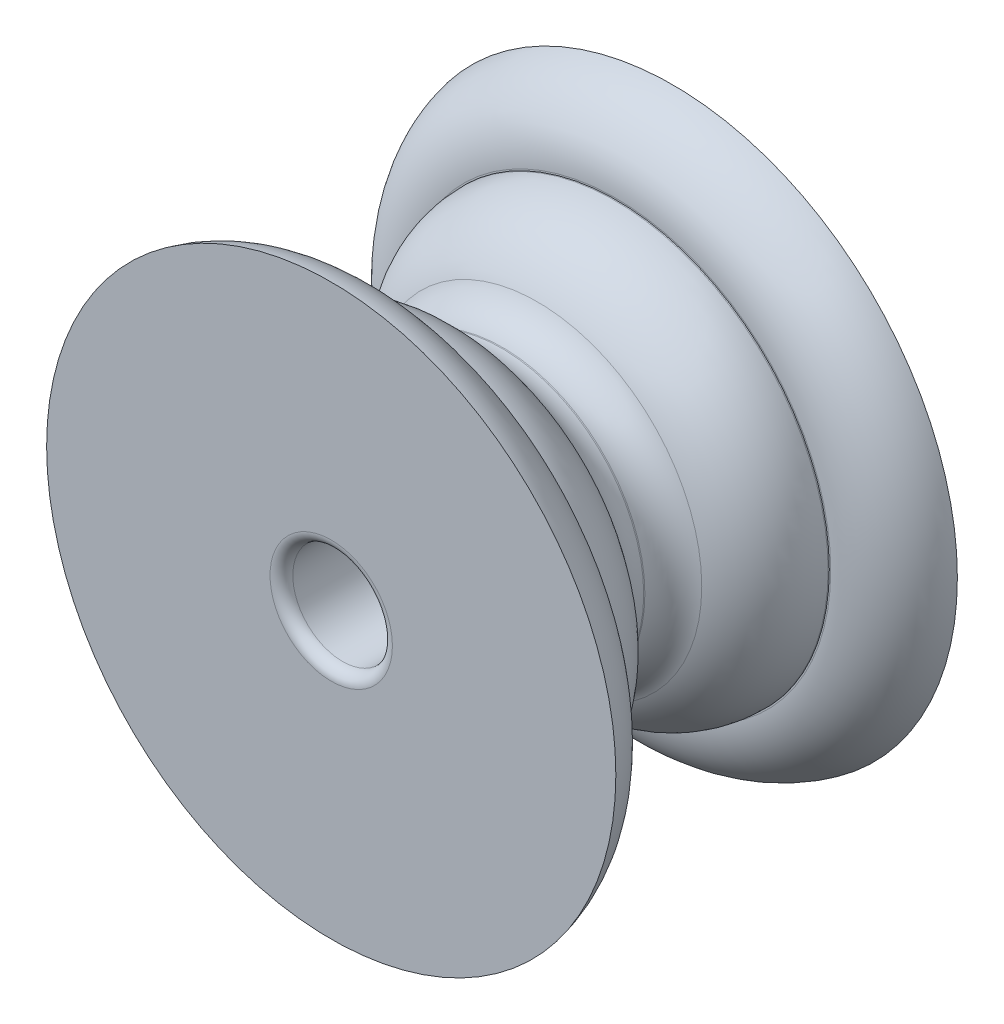
ISO-10303-21;
HEADER;
FILE_DESCRIPTION(('STEP AP214'),'2;1');
FILE_NAME('part.step','',(''),(''),'','','');
FILE_SCHEMA(('AUTOMOTIVE_DESIGN { 1 0 10303 214 1 1 1 1 }'));
ENDSEC;
DATA;
#1=APPLICATION_CONTEXT('core data for automotive mechanical design processes');
#2=APPLICATION_PROTOCOL_DEFINITION('international standard','automotive_design',2000,#1);
#3=PRODUCT_CONTEXT('',#1,'mechanical');
#4=PRODUCT('Part','Part','',(#3));
#5=PRODUCT_RELATED_PRODUCT_CATEGORY('part','',(#4));
#6=PRODUCT_DEFINITION_FORMATION('','',#4);
#7=PRODUCT_DEFINITION_CONTEXT('part definition',#1,'design');
#8=PRODUCT_DEFINITION('design','',#6,#7);
#9=PRODUCT_DEFINITION_SHAPE('','',#8);
#10=(LENGTH_UNIT() NAMED_UNIT(*) SI_UNIT(.MILLI.,.METRE.));
#11=(NAMED_UNIT(*) PLANE_ANGLE_UNIT() SI_UNIT($,.RADIAN.));
#12=(NAMED_UNIT(*) SI_UNIT($,.STERADIAN.) SOLID_ANGLE_UNIT());
#13=UNCERTAINTY_MEASURE_WITH_UNIT(LENGTH_MEASURE(1.E-05),#10,'distance_accuracy_value','');
#14=(GEOMETRIC_REPRESENTATION_CONTEXT(3) GLOBAL_UNCERTAINTY_ASSIGNED_CONTEXT((#13)) GLOBAL_UNIT_ASSIGNED_CONTEXT((#10,
#11,#12)) REPRESENTATION_CONTEXT('',''));
#15=CARTESIAN_POINT('',(0.,0.,0.));
#16=DIRECTION('',(0.,0.,1.));
#17=DIRECTION('',(1.,0.,0.));
#18=AXIS2_PLACEMENT_3D('',#15,#16,#17);
#19=CARTESIAN_POINT('',(0.,0.,2.));
#20=DIRECTION('',(0.,0.,1.));
#21=DIRECTION('',(1.,0.,0.));
#22=AXIS2_PLACEMENT_3D('',#19,#20,#21);
#23=PLANE('',#22);
#24=CARTESIAN_POINT('',(0.,0.,2.));
#25=DIRECTION('',(0.,0.,1.));
#26=DIRECTION('',(1.,0.,0.));
#27=AXIS2_PLACEMENT_3D('',#24,#25,#26);
#28=CIRCLE('',#27,7.55051025721682);
#29=CARTESIAN_POINT('',(7.55051025721682,0.,2.));
#30=VERTEX_POINT('',#29);
#31=EDGE_CURVE('E40',#30,#30,#28,.T.);
#32=ORIENTED_EDGE('',*,*,#31,.T.);
#33=EDGE_LOOP('',(#32));
#34=FACE_BOUND('',#33,.T.);
#35=CARTESIAN_POINT('',(0.,0.,2.));
#36=DIRECTION('',(0.,0.,1.));
#37=DIRECTION('',(1.,0.,0.));
#38=AXIS2_PLACEMENT_3D('',#35,#36,#37);
#39=CIRCLE('',#38,7.5);
#40=CARTESIAN_POINT('',(7.5,0.,2.));
#41=VERTEX_POINT('',#40);
#42=EDGE_CURVE('E77',#41,#41,#39,.T.);
#43=ORIENTED_EDGE('',*,*,#42,.F.);
#44=EDGE_LOOP('',(#43));
#45=FACE_BOUND('',#44,.T.);
#46=ADVANCED_FACE('F33',(#34,#45),#23,.T.);
#47=CARTESIAN_POINT('',(0.,0.,0.));
#48=DIRECTION('',(0.,0.,1.));
#49=DIRECTION('',(1.,0.,0.));
#50=AXIS2_PLACEMENT_3D('',#47,#48,#49);
#51=PLANE('',#50);
#52=CARTESIAN_POINT('',(0.,0.,0.));
#53=DIRECTION('',(0.,0.,1.));
#54=DIRECTION('',(1.,0.,0.));
#55=AXIS2_PLACEMENT_3D('',#52,#53,#54);
#56=CIRCLE('',#55,2.15);
#57=CARTESIAN_POINT('',(2.15,0.,0.));
#58=VERTEX_POINT('',#57);
#59=EDGE_CURVE('E44',#58,#58,#56,.T.);
#60=ORIENTED_EDGE('',*,*,#59,.T.);
#61=EDGE_LOOP('',(#60));
#62=FACE_BOUND('',#61,.T.);
#63=CARTESIAN_POINT('',(0.,0.,0.));
#64=DIRECTION('',(0.,0.,1.));
#65=DIRECTION('',(1.,0.,0.));
#66=AXIS2_PLACEMENT_3D('',#63,#64,#65);
#67=CIRCLE('',#66,10.);
#68=CARTESIAN_POINT('',(10.,0.,0.));
#69=VERTEX_POINT('',#68);
#70=EDGE_CURVE('E78',#69,#69,#67,.T.);
#71=ORIENTED_EDGE('',*,*,#70,.F.);
#72=EDGE_LOOP('',(#71));
#73=FACE_BOUND('',#72,.T.);
#74=ADVANCED_FACE('F101',(#62,#73),#51,.F.);
#75=CARTESIAN_POINT('',(0.,0.,5.));
#76=DIRECTION('',(0.,0.,-1.));
#77=DIRECTION('',(-1.,0.,0.));
#78=AXIS2_PLACEMENT_3D('',#75,#76,#77);
#79=CYLINDRICAL_SURFACE('',#78,7.5);
#80=CARTESIAN_POINT('',(0.,0.,2.04196010845019));
#81=DIRECTION('',(0.,0.,1.));
#82=DIRECTION('',(1.,0.,0.));
#83=AXIS2_PLACEMENT_3D('',#80,#81,#82);
#84=CIRCLE('',#83,7.5);
#85=CARTESIAN_POINT('',(7.5,0.,2.04196010845019));
#86=VERTEX_POINT('',#85);
#87=EDGE_CURVE('E74',#86,#86,#84,.F.);
#88=ORIENTED_EDGE('',*,*,#87,.T.);
#89=EDGE_LOOP('',(#88));
#90=FACE_BOUND('',#89,.T.);
#91=ORIENTED_EDGE('',*,*,#42,.T.);
#92=EDGE_LOOP('',(#91));
#93=FACE_BOUND('',#92,.T.);
#94=ADVANCED_FACE('F108',(#90,#93),#79,.T.);
#95=CARTESIAN_POINT('',(0.,0.,7.));
#96=DIRECTION('',(0.,0.,-1.));
#97=DIRECTION('',(-1.,0.,0.));
#98=AXIS2_PLACEMENT_3D('',#95,#96,#97);
#99=CYLINDRICAL_SURFACE('',#98,5.);
#100=CARTESIAN_POINT('',(0.,0.,5.9789640454561));
#101=DIRECTION('',(0.,0.,1.));
#102=DIRECTION('',(1.,0.,0.));
#103=AXIS2_PLACEMENT_3D('',#100,#101,#102);
#104=CIRCLE('',#103,5.);
#105=CARTESIAN_POINT('',(5.,0.,5.9789640454561));
#106=VERTEX_POINT('',#105);
#107=EDGE_CURVE('E65',#106,#106,#104,.T.);
#108=ORIENTED_EDGE('',*,*,#107,.T.);
#109=EDGE_LOOP('',(#108));
#110=FACE_BOUND('',#109,.T.);
#111=CARTESIAN_POINT('',(0.,0.,6.0210359545439));
#112=DIRECTION('',(0.,0.,1.));
#113=DIRECTION('',(1.,0.,0.));
#114=AXIS2_PLACEMENT_3D('',#111,#112,#113);
#115=CIRCLE('',#114,5.);
#116=CARTESIAN_POINT('',(5.,0.,6.0210359545439));
#117=VERTEX_POINT('',#116);
#118=EDGE_CURVE('E68',#117,#117,#115,.F.);
#119=ORIENTED_EDGE('',*,*,#118,.T.);
#120=EDGE_LOOP('',(#119));
#121=FACE_BOUND('',#120,.T.);
#122=ADVANCED_FACE('F157',(#110,#121),#99,.T.);
#123=CARTESIAN_POINT('',(0.,0.,10.));
#124=DIRECTION('',(0.,0.,-1.));
#125=DIRECTION('',(-1.,0.,0.));
#126=AXIS2_PLACEMENT_3D('',#123,#124,#125);
#127=CYLINDRICAL_SURFACE('',#126,7.5);
#128=CARTESIAN_POINT('',(0.,0.,9.95803989154981));
#129=DIRECTION('',(0.,0.,-1.));
#130=DIRECTION('',(-1.,0.,0.));
#131=AXIS2_PLACEMENT_3D('',#128,#129,#130);
#132=CIRCLE('',#131,7.5);
#133=CARTESIAN_POINT('',(-7.5,0.,9.95803989154981));
#134=VERTEX_POINT('',#133);
#135=EDGE_CURVE('E71',#134,#134,#132,.F.);
#136=ORIENTED_EDGE('',*,*,#135,.T.);
#137=EDGE_LOOP('',(#136));
#138=FACE_BOUND('',#137,.T.);
#139=CARTESIAN_POINT('',(0.,0.,10.));
#140=DIRECTION('',(0.,0.,1.));
#141=DIRECTION('',(1.,0.,0.));
#142=AXIS2_PLACEMENT_3D('',#139,#140,#141);
#143=CIRCLE('',#142,7.5);
#144=CARTESIAN_POINT('',(7.5,0.,10.));
#145=VERTEX_POINT('',#144);
#146=EDGE_CURVE('E81',#145,#145,#143,.T.);
#147=ORIENTED_EDGE('',*,*,#146,.F.);
#148=EDGE_LOOP('',(#147));
#149=FACE_BOUND('',#148,.T.);
#150=ADVANCED_FACE('F153',(#138,#149),#127,.T.);
#151=CARTESIAN_POINT('',(0.,0.,12.));
#152=DIRECTION('',(0.,0.,1.));
#153=DIRECTION('',(1.,0.,0.));
#154=AXIS2_PLACEMENT_3D('',#151,#152,#153);
#155=PLANE('',#154);
#156=CARTESIAN_POINT('',(0.,0.,12.));
#157=DIRECTION('',(0.,0.,1.));
#158=DIRECTION('',(1.,0.,0.));
#159=AXIS2_PLACEMENT_3D('',#156,#157,#158);
#160=CIRCLE('',#159,2.15);
#161=CARTESIAN_POINT('',(2.15,0.,12.));
#162=VERTEX_POINT('',#161);
#163=EDGE_CURVE('E48',#162,#162,#160,.F.);
#164=ORIENTED_EDGE('',*,*,#163,.T.);
#165=EDGE_LOOP('',(#164));
#166=FACE_BOUND('',#165,.T.);
#167=CARTESIAN_POINT('',(0.,0.,12.));
#168=DIRECTION('',(0.,0.,1.));
#169=DIRECTION('',(1.,0.,0.));
#170=AXIS2_PLACEMENT_3D('',#167,#168,#169);
#171=CIRCLE('',#170,10.);
#172=CARTESIAN_POINT('',(10.,0.,12.));
#173=VERTEX_POINT('',#172);
#174=EDGE_CURVE('E86',#173,#173,#171,.T.);
#175=ORIENTED_EDGE('',*,*,#174,.T.);
#176=EDGE_LOOP('',(#175));
#177=FACE_BOUND('',#176,.T.);
#178=ADVANCED_FACE('F90',(#166,#177),#155,.T.);
#179=CARTESIAN_POINT('',(0.,0.,10.));
#180=DIRECTION('',(0.,0.,1.));
#181=DIRECTION('',(1.,0.,0.));
#182=AXIS2_PLACEMENT_3D('',#179,#180,#181);
#183=PLANE('',#182);
#184=CARTESIAN_POINT('',(0.,0.,10.));
#185=DIRECTION('',(0.,0.,1.));
#186=DIRECTION('',(1.,0.,0.));
#187=AXIS2_PLACEMENT_3D('',#184,#185,#186);
#188=CIRCLE('',#187,7.55051025721682);
#189=CARTESIAN_POINT('',(7.55051025721682,0.,10.));
#190=VERTEX_POINT('',#189);
#191=EDGE_CURVE('E10',#190,#190,#188,.F.);
#192=ORIENTED_EDGE('',*,*,#191,.T.);
#193=EDGE_LOOP('',(#192));
#194=FACE_BOUND('',#193,.T.);
#195=ORIENTED_EDGE('',*,*,#146,.T.);
#196=EDGE_LOOP('',(#195));
#197=FACE_BOUND('',#196,.T.);
#198=ADVANCED_FACE('F144',(#194,#197),#183,.F.);
#199=CARTESIAN_POINT('',(0.,0.,22.));
#200=DIRECTION('',(0.,0.,-1.));
#201=DIRECTION('',(-1.,0.,0.));
#202=AXIS2_PLACEMENT_3D('',#199,#200,#201);
#203=CYLINDRICAL_SURFACE('',#202,1.75);
#204=CARTESIAN_POINT('',(0.,0.,11.6));
#205=DIRECTION('',(0.,0.,1.));
#206=DIRECTION('',(1.,0.,0.));
#207=AXIS2_PLACEMENT_3D('',#204,#205,#206);
#208=CIRCLE('',#207,1.75);
#209=CARTESIAN_POINT('',(1.75,0.,11.6));
#210=VERTEX_POINT('',#209);
#211=EDGE_CURVE('E53',#210,#210,#208,.T.);
#212=ORIENTED_EDGE('',*,*,#211,.T.);
#213=EDGE_LOOP('',(#212));
#214=FACE_BOUND('',#213,.T.);
#215=CARTESIAN_POINT('',(0.,0.,0.400000000000001));
#216=DIRECTION('',(0.,0.,1.));
#217=DIRECTION('',(1.,0.,0.));
#218=AXIS2_PLACEMENT_3D('',#215,#216,#217);
#219=CIRCLE('',#218,1.75);
#220=CARTESIAN_POINT('',(1.75,0.,0.400000000000001));
#221=VERTEX_POINT('',#220);
#222=EDGE_CURVE('E56',#221,#221,#219,.F.);
#223=ORIENTED_EDGE('',*,*,#222,.T.);
#224=EDGE_LOOP('',(#223));
#225=FACE_BOUND('',#224,.T.);
#226=ADVANCED_FACE('F119',(#214,#225),#203,.F.);
#227=CARTESIAN_POINT('',(0.,0.,2.04196010845019));
#228=DIRECTION('',(0.,0.,1.));
#229=DIRECTION('',(1.,0.,0.));
#230=AXIS2_PLACEMENT_3D('',#227,#228,#229);
#231=TOROIDAL_SURFACE('',#230,4.5,3.);
#232=CARTESIAN_POINT('',(0.,0.,4.75713523741979));
#233=DIRECTION('',(0.,0.,-1.));
#234=DIRECTION('',(-1.,0.,0.));
#235=AXIS2_PLACEMENT_3D('',#232,#233,#234);
#236=CIRCLE('',#235,5.77586206896552);
#237=CARTESIAN_POINT('',(-5.77586206896552,0.,4.75713523741979));
#238=VERTEX_POINT('',#237);
#239=EDGE_CURVE('E62',#238,#238,#236,.T.);
#240=ORIENTED_EDGE('',*,*,#239,.T.);
#241=EDGE_LOOP('',(#240));
#242=FACE_BOUND('',#241,.T.);
#243=ORIENTED_EDGE('',*,*,#87,.F.);
#244=EDGE_LOOP('',(#243));
#245=FACE_BOUND('',#244,.T.);
#246=ADVANCED_FACE('F115',(#242,#245),#231,.T.);
#247=CARTESIAN_POINT('',(0.,0.,9.95803989154981));
#248=DIRECTION('',(0.,0.,-1.));
#249=DIRECTION('',(-1.,0.,0.));
#250=AXIS2_PLACEMENT_3D('',#247,#248,#249);
#251=TOROIDAL_SURFACE('',#250,4.5,3.);
#252=CARTESIAN_POINT('',(0.,0.,7.24286476258021));
#253=DIRECTION('',(0.,0.,1.));
#254=DIRECTION('',(1.,0.,0.));
#255=AXIS2_PLACEMENT_3D('',#252,#253,#254);
#256=CIRCLE('',#255,5.77586206896552);
#257=CARTESIAN_POINT('',(5.77586206896552,0.,7.24286476258021));
#258=VERTEX_POINT('',#257);
#259=EDGE_CURVE('E59',#258,#258,#256,.T.);
#260=ORIENTED_EDGE('',*,*,#259,.T.);
#261=EDGE_LOOP('',(#260));
#262=FACE_BOUND('',#261,.T.);
#263=ORIENTED_EDGE('',*,*,#135,.F.);
#264=EDGE_LOOP('',(#263));
#265=FACE_BOUND('',#264,.T.);
#266=ADVANCED_FACE('F118',(#262,#265),#251,.T.);
#267=CARTESIAN_POINT('',(0.,0.,5.9789640454561));
#268=DIRECTION('',(0.,0.,1.));
#269=DIRECTION('',(1.,0.,0.));
#270=AXIS2_PLACEMENT_3D('',#267,#268,#269);
#271=TOROIDAL_SURFACE('',#270,6.35,1.35);
#272=ORIENTED_EDGE('',*,*,#239,.F.);
#273=EDGE_LOOP('',(#272));
#274=FACE_BOUND('',#273,.T.);
#275=ORIENTED_EDGE('',*,*,#107,.F.);
#276=EDGE_LOOP('',(#275));
#277=FACE_BOUND('',#276,.T.);
#278=ADVANCED_FACE('F123',(#274,#277),#271,.F.);
#279=CARTESIAN_POINT('',(0.,0.,6.0210359545439));
#280=DIRECTION('',(0.,0.,1.));
#281=DIRECTION('',(1.,0.,0.));
#282=AXIS2_PLACEMENT_3D('',#279,#280,#281);
#283=TOROIDAL_SURFACE('',#282,6.35,1.35);
#284=ORIENTED_EDGE('',*,*,#118,.F.);
#285=EDGE_LOOP('',(#284));
#286=FACE_BOUND('',#285,.T.);
#287=ORIENTED_EDGE('',*,*,#259,.F.);
#288=EDGE_LOOP('',(#287));
#289=FACE_BOUND('',#288,.T.);
#290=ADVANCED_FACE('F127',(#286,#289),#283,.F.);
#291=CARTESIAN_POINT('',(0.,0.,11.6));
#292=DIRECTION('',(0.,0.,1.));
#293=DIRECTION('',(1.,0.,0.));
#294=AXIS2_PLACEMENT_3D('',#291,#292,#293);
#295=TOROIDAL_SURFACE('',#294,2.15,0.4);
#296=ORIENTED_EDGE('',*,*,#163,.F.);
#297=EDGE_LOOP('',(#296));
#298=FACE_BOUND('',#297,.T.);
#299=ORIENTED_EDGE('',*,*,#211,.F.);
#300=EDGE_LOOP('',(#299));
#301=FACE_BOUND('',#300,.T.);
#302=ADVANCED_FACE('F131',(#298,#301),#295,.T.);
#303=CARTESIAN_POINT('',(0.,0.,0.400000000000001));
#304=DIRECTION('',(0.,0.,1.));
#305=DIRECTION('',(1.,0.,0.));
#306=AXIS2_PLACEMENT_3D('',#303,#304,#305);
#307=TOROIDAL_SURFACE('',#306,2.15,0.4);
#308=ORIENTED_EDGE('',*,*,#59,.F.);
#309=EDGE_LOOP('',(#308));
#310=FACE_BOUND('',#309,.T.);
#311=ORIENTED_EDGE('',*,*,#222,.F.);
#312=EDGE_LOOP('',(#311));
#313=FACE_BOUND('',#312,.T.);
#314=ADVANCED_FACE('F98',(#310,#313),#307,.T.);
#315=CARTESIAN_POINT('',(0.,0.,-0.5));
#316=DIRECTION('',(0.,0.,-1.));
#317=DIRECTION('',(-1.,0.,0.));
#318=AXIS2_PLACEMENT_3D('',#315,#316,#317);
#319=TOROIDAL_SURFACE('',#318,7.55051025721682,2.5);
#320=ORIENTED_EDGE('',*,*,#70,.T.);
#321=EDGE_LOOP('',(#320));
#322=FACE_BOUND('',#321,.T.);
#323=ORIENTED_EDGE('',*,*,#31,.F.);
#324=EDGE_LOOP('',(#323));
#325=FACE_BOUND('',#324,.T.);
#326=ADVANCED_FACE('F93',(#322,#325),#319,.T.);
#327=CARTESIAN_POINT('',(0.,0.,12.5));
#328=DIRECTION('',(0.,0.,-1.));
#329=DIRECTION('',(-1.,0.,0.));
#330=AXIS2_PLACEMENT_3D('',#327,#328,#329);
#331=TOROIDAL_SURFACE('',#330,7.55051025721682,2.5);
#332=ORIENTED_EDGE('',*,*,#191,.F.);
#333=EDGE_LOOP('',(#332));
#334=FACE_BOUND('',#333,.T.);
#335=ORIENTED_EDGE('',*,*,#174,.F.);
#336=EDGE_LOOP('',(#335));
#337=FACE_BOUND('',#336,.T.);
#338=ADVANCED_FACE('F35',(#334,#337),#331,.T.);
#339=CLOSED_SHELL('',(#46,#74,#94,#122,#150,#178,#198,#226,#246,#266,#278,#290,#302,#314,#326,#338));
#340=MANIFOLD_SOLID_BREP('B2',#339);
#341=ADVANCED_BREP_SHAPE_REPRESENTATION('',(#18,#340),#14);
#342=SHAPE_DEFINITION_REPRESENTATION(#9,#341);
ENDSEC;
END-ISO-10303-21;
